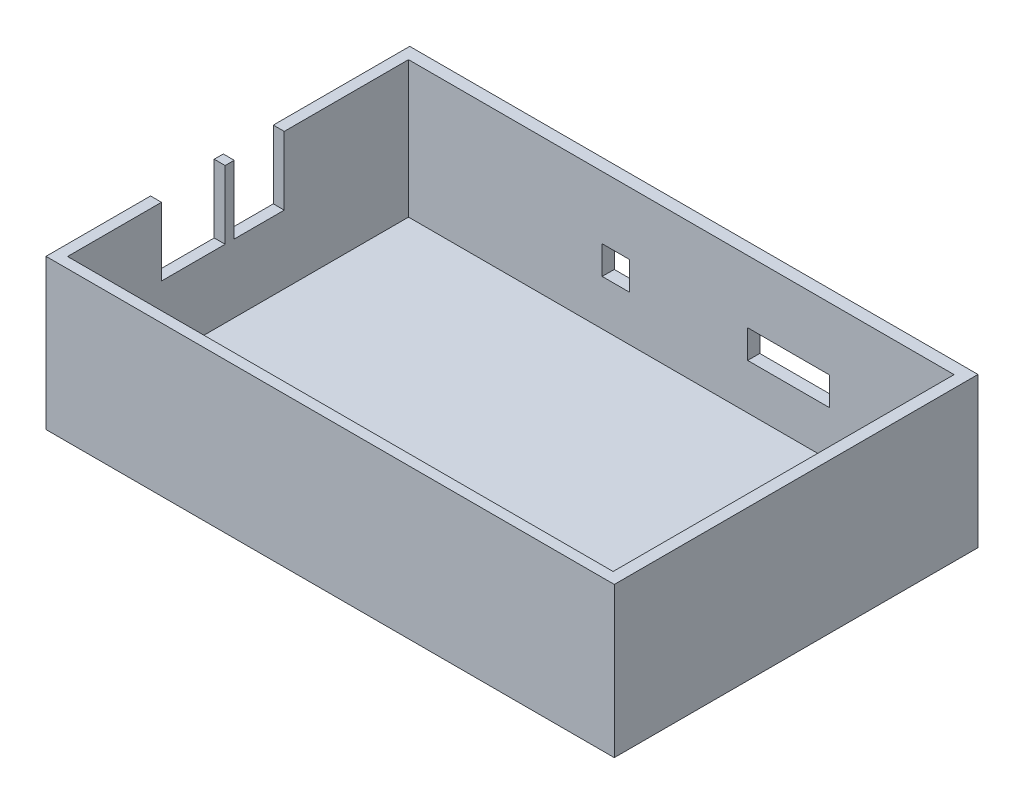
ISO-10303-21;
HEADER;
FILE_DESCRIPTION(('STEP AP214'),'2;1');
FILE_NAME('part.step','',(''),(''),'','','');
FILE_SCHEMA(('AUTOMOTIVE_DESIGN { 1 0 10303 214 1 1 1 1 }'));
ENDSEC;
DATA;
#1=APPLICATION_CONTEXT('core data for automotive mechanical design processes');
#2=APPLICATION_PROTOCOL_DEFINITION('international standard','automotive_design',2000,#1);
#3=PRODUCT_CONTEXT('',#1,'mechanical');
#4=PRODUCT('Part','Part','',(#3));
#5=PRODUCT_RELATED_PRODUCT_CATEGORY('part','',(#4));
#6=PRODUCT_DEFINITION_FORMATION('','',#4);
#7=PRODUCT_DEFINITION_CONTEXT('part definition',#1,'design');
#8=PRODUCT_DEFINITION('design','',#6,#7);
#9=PRODUCT_DEFINITION_SHAPE('','',#8);
#10=(LENGTH_UNIT() NAMED_UNIT(*) SI_UNIT(.MILLI.,.METRE.));
#11=(NAMED_UNIT(*) PLANE_ANGLE_UNIT() SI_UNIT($,.RADIAN.));
#12=(NAMED_UNIT(*) SI_UNIT($,.STERADIAN.) SOLID_ANGLE_UNIT());
#13=UNCERTAINTY_MEASURE_WITH_UNIT(LENGTH_MEASURE(1.E-05),#10,'distance_accuracy_value','');
#14=(GEOMETRIC_REPRESENTATION_CONTEXT(3) GLOBAL_UNCERTAINTY_ASSIGNED_CONTEXT((#13)) GLOBAL_UNIT_ASSIGNED_CONTEXT((#10,
#11,#12)) REPRESENTATION_CONTEXT('',''));
#15=CARTESIAN_POINT('',(0.,0.,0.));
#16=DIRECTION('',(0.,0.,1.));
#17=DIRECTION('',(1.,0.,0.));
#18=AXIS2_PLACEMENT_3D('',#15,#16,#17);
#19=CARTESIAN_POINT('',(0.,33.,0.));
#20=DIRECTION('',(0.,-1.,0.));
#21=DIRECTION('',(0.,0.,-1.));
#22=AXIS2_PLACEMENT_3D('',#19,#20,#21);
#23=PLANE('',#22);
#24=DIRECTION('',(0.,0.,1.));
#25=VECTOR('',#24,1.);
#26=CARTESIAN_POINT('',(0.,33.,0.));
#27=LINE('',#26,#25);
#28=CARTESIAN_POINT('',(0.,33.,-39.));
#29=VERTEX_POINT('',#28);
#30=CARTESIAN_POINT('',(0.,33.,-37.));
#31=VERTEX_POINT('',#30);
#32=EDGE_CURVE('E365',#29,#31,#27,.T.);
#33=ORIENTED_EDGE('',*,*,#32,.T.);
#34=DIRECTION('',(-1.,0.,0.));
#35=VECTOR('',#34,1.);
#36=CARTESIAN_POINT('',(-6.18134802853958,33.,-37.));
#37=LINE('',#36,#35);
#38=CARTESIAN_POINT('',(2.40382047502787,33.,-37.));
#39=VERTEX_POINT('',#38);
#40=EDGE_CURVE('E271',#39,#31,#37,.T.);
#41=ORIENTED_EDGE('',*,*,#40,.F.);
#42=DIRECTION('',(0.,0.,1.));
#43=VECTOR('',#42,1.);
#44=CARTESIAN_POINT('',(2.40382047502787,33.,-77.3360349520913));
#45=LINE('',#44,#43);
#46=CARTESIAN_POINT('',(2.40382047502787,33.,-39.));
#47=VERTEX_POINT('',#46);
#48=EDGE_CURVE('E337',#47,#39,#45,.T.);
#49=ORIENTED_EDGE('',*,*,#48,.F.);
#50=DIRECTION('',(1.,0.,0.));
#51=VECTOR('',#50,1.);
#52=CARTESIAN_POINT('',(-5.21205481039487,33.,-39.));
#53=LINE('',#52,#51);
#54=EDGE_CURVE('E236',#29,#47,#53,.T.);
#55=ORIENTED_EDGE('',*,*,#54,.F.);
#56=EDGE_LOOP('',(#33,#41,#49,#55));
#57=FACE_BOUND('',#56,.T.);
#58=ADVANCED_FACE('F36',(#57),#23,.F.);
#59=CARTESIAN_POINT('',(0.,33.,0.));
#60=DIRECTION('',(1.,0.,0.));
#61=DIRECTION('',(0.,0.,-1.));
#62=AXIS2_PLACEMENT_3D('',#59,#60,#61);
#63=PLANE('',#62);
#64=DIRECTION('',(0.,0.,1.));
#65=VECTOR('',#64,1.);
#66=CARTESIAN_POINT('',(0.,18.,0.));
#67=LINE('',#66,#65);
#68=CARTESIAN_POINT('',(0.,18.,-37.));
#69=VERTEX_POINT('',#68);
#70=CARTESIAN_POINT('',(0.,18.,-23.));
#71=VERTEX_POINT('',#70);
#72=EDGE_CURVE('E303',#69,#71,#67,.T.);
#73=ORIENTED_EDGE('',*,*,#72,.F.);
#74=DIRECTION('',(0.,1.,0.));
#75=VECTOR('',#74,1.);
#76=CARTESIAN_POINT('',(0.,33.,-37.));
#77=LINE('',#76,#75);
#78=EDGE_CURVE('E309',#69,#31,#77,.T.);
#79=ORIENTED_EDGE('',*,*,#78,.T.);
#80=ORIENTED_EDGE('',*,*,#32,.F.);
#81=DIRECTION('',(0.,-1.,0.));
#82=VECTOR('',#81,1.);
#83=CARTESIAN_POINT('',(0.,33.,-39.));
#84=LINE('',#83,#82);
#85=CARTESIAN_POINT('',(0.,18.,-39.));
#86=VERTEX_POINT('',#85);
#87=EDGE_CURVE('E295',#29,#86,#84,.T.);
#88=ORIENTED_EDGE('',*,*,#87,.T.);
#89=DIRECTION('',(0.,0.,1.));
#90=VECTOR('',#89,1.);
#91=CARTESIAN_POINT('',(0.,18.,0.));
#92=LINE('',#91,#90);
#93=CARTESIAN_POINT('',(0.,18.,-50.));
#94=VERTEX_POINT('',#93);
#95=EDGE_CURVE('E275',#94,#86,#92,.T.);
#96=ORIENTED_EDGE('',*,*,#95,.F.);
#97=DIRECTION('',(0.,1.,0.));
#98=VECTOR('',#97,1.);
#99=CARTESIAN_POINT('',(0.,33.,-50.));
#100=LINE('',#99,#98);
#101=CARTESIAN_POINT('',(0.,33.,-50.));
#102=VERTEX_POINT('',#101);
#103=EDGE_CURVE('E299',#94,#102,#100,.T.);
#104=ORIENTED_EDGE('',*,*,#103,.T.);
#105=CARTESIAN_POINT('',(0.,33.,-80.));
#106=VERTEX_POINT('',#105);
#107=EDGE_CURVE('E360',#106,#102,#27,.T.);
#108=ORIENTED_EDGE('',*,*,#107,.F.);
#109=DIRECTION('',(0.,-1.,0.));
#110=VECTOR('',#109,1.);
#111=CARTESIAN_POINT('',(0.,33.,-80.));
#112=LINE('',#111,#110);
#113=CARTESIAN_POINT('',(0.,0.,-80.));
#114=VERTEX_POINT('',#113);
#115=EDGE_CURVE('E375',#106,#114,#112,.T.);
#116=ORIENTED_EDGE('',*,*,#115,.T.);
#117=DIRECTION('',(0.,0.,1.));
#118=VECTOR('',#117,1.);
#119=CARTESIAN_POINT('',(0.,0.,0.));
#120=LINE('',#119,#118);
#121=CARTESIAN_POINT('',(0.,0.,0.));
#122=VERTEX_POINT('',#121);
#123=EDGE_CURVE('E350',#114,#122,#120,.T.);
#124=ORIENTED_EDGE('',*,*,#123,.T.);
#125=DIRECTION('',(0.,-1.,0.));
#126=VECTOR('',#125,1.);
#127=CARTESIAN_POINT('',(0.,33.,0.));
#128=LINE('',#127,#126);
#129=CARTESIAN_POINT('',(0.,33.,0.));
#130=VERTEX_POINT('',#129);
#131=EDGE_CURVE('E399',#130,#122,#128,.T.);
#132=ORIENTED_EDGE('',*,*,#131,.F.);
#133=CARTESIAN_POINT('',(0.,33.,-23.));
#134=VERTEX_POINT('',#133);
#135=EDGE_CURVE('E366',#134,#130,#27,.T.);
#136=ORIENTED_EDGE('',*,*,#135,.F.);
#137=DIRECTION('',(0.,-1.,0.));
#138=VECTOR('',#137,1.);
#139=CARTESIAN_POINT('',(0.,33.,-23.));
#140=LINE('',#139,#138);
#141=EDGE_CURVE('E306',#134,#71,#140,.T.);
#142=ORIENTED_EDGE('',*,*,#141,.T.);
#143=EDGE_LOOP('',(#73,#79,#80,#88,#96,#104,#108,#116,#124,#132,#136,#142));
#144=FACE_BOUND('',#143,.T.);
#145=ADVANCED_FACE('F38',(#144),#63,.F.);
#146=CARTESIAN_POINT('',(0.,33.,0.));
#147=DIRECTION('',(0.,0.,-1.));
#148=DIRECTION('',(-1.,0.,0.));
#149=AXIS2_PLACEMENT_3D('',#146,#147,#148);
#150=PLANE('',#149);
#151=DIRECTION('',(1.,0.,0.));
#152=VECTOR('',#151,1.);
#153=CARTESIAN_POINT('',(0.,0.,0.));
#154=LINE('',#153,#152);
#155=CARTESIAN_POINT('',(125.,0.,0.));
#156=VERTEX_POINT('',#155);
#157=EDGE_CURVE('E379',#122,#156,#154,.T.);
#158=ORIENTED_EDGE('',*,*,#157,.T.);
#159=DIRECTION('',(0.,-1.,0.));
#160=VECTOR('',#159,1.);
#161=CARTESIAN_POINT('',(125.,33.,0.));
#162=LINE('',#161,#160);
#163=CARTESIAN_POINT('',(125.,33.,0.));
#164=VERTEX_POINT('',#163);
#165=EDGE_CURVE('E395',#164,#156,#162,.T.);
#166=ORIENTED_EDGE('',*,*,#165,.F.);
#167=DIRECTION('',(1.,0.,0.));
#168=VECTOR('',#167,1.);
#169=CARTESIAN_POINT('',(0.,33.,0.));
#170=LINE('',#169,#168);
#171=EDGE_CURVE('E364',#130,#164,#170,.T.);
#172=ORIENTED_EDGE('',*,*,#171,.F.);
#173=ORIENTED_EDGE('',*,*,#131,.T.);
#174=EDGE_LOOP('',(#158,#166,#172,#173));
#175=FACE_BOUND('',#174,.T.);
#176=ADVANCED_FACE('F472',(#175),#150,.F.);
#177=CARTESIAN_POINT('',(125.,33.,0.));
#178=DIRECTION('',(-1.,0.,0.));
#179=DIRECTION('',(0.,0.,1.));
#180=AXIS2_PLACEMENT_3D('',#177,#178,#179);
#181=PLANE('',#180);
#182=DIRECTION('',(0.,0.,-1.));
#183=VECTOR('',#182,1.);
#184=CARTESIAN_POINT('',(125.,0.,0.));
#185=LINE('',#184,#183);
#186=CARTESIAN_POINT('',(125.,0.,-80.));
#187=VERTEX_POINT('',#186);
#188=EDGE_CURVE('E382',#156,#187,#185,.T.);
#189=ORIENTED_EDGE('',*,*,#188,.T.);
#190=DIRECTION('',(0.,-1.,0.));
#191=VECTOR('',#190,1.);
#192=CARTESIAN_POINT('',(125.,33.,-80.));
#193=LINE('',#192,#191);
#194=CARTESIAN_POINT('',(125.,33.,-80.));
#195=VERTEX_POINT('',#194);
#196=EDGE_CURVE('E391',#195,#187,#193,.T.);
#197=ORIENTED_EDGE('',*,*,#196,.F.);
#198=DIRECTION('',(0.,0.,-1.));
#199=VECTOR('',#198,1.);
#200=CARTESIAN_POINT('',(125.,33.,0.));
#201=LINE('',#200,#199);
#202=EDGE_CURVE('E369',#164,#195,#201,.T.);
#203=ORIENTED_EDGE('',*,*,#202,.F.);
#204=ORIENTED_EDGE('',*,*,#165,.T.);
#205=EDGE_LOOP('',(#189,#197,#203,#204));
#206=FACE_BOUND('',#205,.T.);
#207=ADVANCED_FACE('F485',(#206),#181,.F.);
#208=CARTESIAN_POINT('',(0.,33.,-80.));
#209=DIRECTION('',(0.,0.,1.));
#210=DIRECTION('',(1.,0.,0.));
#211=AXIS2_PLACEMENT_3D('',#208,#209,#210);
#212=PLANE('',#211);
#213=DIRECTION('',(1.,0.,0.));
#214=VECTOR('',#213,1.);
#215=CARTESIAN_POINT('',(45.,19.2311706880732,-80.));
#216=LINE('',#215,#214);
#217=CARTESIAN_POINT('',(45.,19.2311706880732,-80.));
#218=VERTEX_POINT('',#217);
#219=CARTESIAN_POINT('',(51.,19.2311706880732,-80.));
#220=VERTEX_POINT('',#219);
#221=EDGE_CURVE('E216',#218,#220,#216,.T.);
#222=ORIENTED_EDGE('',*,*,#221,.F.);
#223=DIRECTION('',(0.,1.,0.));
#224=VECTOR('',#223,1.);
#225=CARTESIAN_POINT('',(45.,13.,-80.));
#226=LINE('',#225,#224);
#227=CARTESIAN_POINT('',(45.,13.,-80.));
#228=VERTEX_POINT('',#227);
#229=EDGE_CURVE('E52',#228,#218,#226,.T.);
#230=ORIENTED_EDGE('',*,*,#229,.F.);
#231=DIRECTION('',(-1.,0.,0.));
#232=VECTOR('',#231,1.);
#233=CARTESIAN_POINT('',(45.,13.,-80.));
#234=LINE('',#233,#232);
#235=CARTESIAN_POINT('',(51.,13.,-80.));
#236=VERTEX_POINT('',#235);
#237=EDGE_CURVE('E224',#236,#228,#234,.T.);
#238=ORIENTED_EDGE('',*,*,#237,.F.);
#239=DIRECTION('',(0.,-1.,0.));
#240=VECTOR('',#239,1.);
#241=CARTESIAN_POINT('',(51.,13.,-80.));
#242=LINE('',#241,#240);
#243=EDGE_CURVE('E205',#220,#236,#242,.T.);
#244=ORIENTED_EDGE('',*,*,#243,.F.);
#245=EDGE_LOOP('',(#222,#230,#238,#244));
#246=FACE_BOUND('',#245,.T.);
#247=DIRECTION('',(1.,0.,0.));
#248=VECTOR('',#247,1.);
#249=CARTESIAN_POINT('',(77.,19.2311706880731,-80.));
#250=LINE('',#249,#248);
#251=CARTESIAN_POINT('',(77.,19.2311706880731,-80.));
#252=VERTEX_POINT('',#251);
#253=CARTESIAN_POINT('',(95.,19.2311706880731,-80.));
#254=VERTEX_POINT('',#253);
#255=EDGE_CURVE('E243',#252,#254,#250,.T.);
#256=ORIENTED_EDGE('',*,*,#255,.F.);
#257=DIRECTION('',(0.,1.,0.));
#258=VECTOR('',#257,1.);
#259=CARTESIAN_POINT('',(77.,13.,-80.));
#260=LINE('',#259,#258);
#261=CARTESIAN_POINT('',(77.,13.,-80.));
#262=VERTEX_POINT('',#261);
#263=EDGE_CURVE('E60',#262,#252,#260,.T.);
#264=ORIENTED_EDGE('',*,*,#263,.F.);
#265=DIRECTION('',(-1.,0.,0.));
#266=VECTOR('',#265,1.);
#267=CARTESIAN_POINT('',(77.,13.,-80.));
#268=LINE('',#267,#266);
#269=CARTESIAN_POINT('',(95.,13.,-80.));
#270=VERTEX_POINT('',#269);
#271=EDGE_CURVE('E251',#270,#262,#268,.T.);
#272=ORIENTED_EDGE('',*,*,#271,.F.);
#273=DIRECTION('',(0.,-1.,0.));
#274=VECTOR('',#273,1.);
#275=CARTESIAN_POINT('',(95.,13.,-80.));
#276=LINE('',#275,#274);
#277=EDGE_CURVE('E247',#254,#270,#276,.T.);
#278=ORIENTED_EDGE('',*,*,#277,.F.);
#279=EDGE_LOOP('',(#256,#264,#272,#278));
#280=FACE_BOUND('',#279,.T.);
#281=DIRECTION('',(-1.,0.,0.));
#282=VECTOR('',#281,1.);
#283=CARTESIAN_POINT('',(0.,0.,-80.));
#284=LINE('',#283,#282);
#285=EDGE_CURVE('E385',#187,#114,#284,.T.);
#286=ORIENTED_EDGE('',*,*,#285,.T.);
#287=ORIENTED_EDGE('',*,*,#115,.F.);
#288=DIRECTION('',(-1.,0.,0.));
#289=VECTOR('',#288,1.);
#290=CARTESIAN_POINT('',(0.,33.,-80.));
#291=LINE('',#290,#289);
#292=EDGE_CURVE('E372',#195,#106,#291,.T.);
#293=ORIENTED_EDGE('',*,*,#292,.F.);
#294=ORIENTED_EDGE('',*,*,#196,.T.);
#295=EDGE_LOOP('',(#286,#287,#293,#294));
#296=FACE_BOUND('',#295,.T.);
#297=ADVANCED_FACE('F221',(#246,#280,#296),#212,.F.);
#298=CARTESIAN_POINT('',(2.40382047502787,33.,-23.));
#299=VERTEX_POINT('',#298);
#300=CARTESIAN_POINT('',(2.40382047502787,33.,-2.33603495209132));
#301=VERTEX_POINT('',#300);
#302=EDGE_CURVE('E313',#299,#301,#45,.T.);
#303=ORIENTED_EDGE('',*,*,#302,.F.);
#304=DIRECTION('',(1.,0.,0.));
#305=VECTOR('',#304,1.);
#306=CARTESIAN_POINT('',(-6.18134802853958,33.,-23.));
#307=LINE('',#306,#305);
#308=EDGE_CURVE('E276',#134,#299,#307,.T.);
#309=ORIENTED_EDGE('',*,*,#308,.F.);
#310=ORIENTED_EDGE('',*,*,#135,.T.);
#311=ORIENTED_EDGE('',*,*,#171,.T.);
#312=ORIENTED_EDGE('',*,*,#202,.T.);
#313=ORIENTED_EDGE('',*,*,#292,.T.);
#314=ORIENTED_EDGE('',*,*,#107,.T.);
#315=DIRECTION('',(-1.,0.,0.));
#316=VECTOR('',#315,1.);
#317=CARTESIAN_POINT('',(-5.21205481039487,33.,-50.));
#318=LINE('',#317,#316);
#319=CARTESIAN_POINT('',(2.40382047502786,33.,-50.));
#320=VERTEX_POINT('',#319);
#321=EDGE_CURVE('E285',#320,#102,#318,.T.);
#322=ORIENTED_EDGE('',*,*,#321,.F.);
#323=CARTESIAN_POINT('',(2.40382047502787,33.,-77.3360349520913));
#324=VERTEX_POINT('',#323);
#325=EDGE_CURVE('E332',#324,#320,#45,.T.);
#326=ORIENTED_EDGE('',*,*,#325,.F.);
#327=DIRECTION('',(-1.,0.,0.));
#328=VECTOR('',#327,1.);
#329=CARTESIAN_POINT('',(2.40382047502787,33.,-77.3360349520913));
#330=LINE('',#329,#328);
#331=CARTESIAN_POINT('',(122.403820475028,33.,-77.3360349520913));
#332=VERTEX_POINT('',#331);
#333=EDGE_CURVE('E319',#332,#324,#330,.T.);
#334=ORIENTED_EDGE('',*,*,#333,.F.);
#335=DIRECTION('',(0.,0.,-1.));
#336=VECTOR('',#335,1.);
#337=CARTESIAN_POINT('',(122.403820475028,33.,-77.3360349520913));
#338=LINE('',#337,#336);
#339=CARTESIAN_POINT('',(122.403820475028,33.,-2.33603495209132));
#340=VERTEX_POINT('',#339);
#341=EDGE_CURVE('E341',#340,#332,#338,.T.);
#342=ORIENTED_EDGE('',*,*,#341,.F.);
#343=DIRECTION('',(1.,0.,0.));
#344=VECTOR('',#343,1.);
#345=CARTESIAN_POINT('',(2.40382047502787,33.,-2.33603495209132));
#346=LINE('',#345,#344);
#347=EDGE_CURVE('E336',#301,#340,#346,.T.);
#348=ORIENTED_EDGE('',*,*,#347,.F.);
#349=EDGE_LOOP('',(#303,#309,#310,#311,#312,#313,#314,#322,#326,#334,#342,#348));
#350=FACE_BOUND('',#349,.T.);
#351=ADVANCED_FACE('F469',(#350),#23,.F.);
#352=CARTESIAN_POINT('',(0.,0.,0.));
#353=DIRECTION('',(0.,-1.,0.));
#354=DIRECTION('',(0.,0.,-1.));
#355=AXIS2_PLACEMENT_3D('',#352,#353,#354);
#356=PLANE('',#355);
#357=ORIENTED_EDGE('',*,*,#123,.F.);
#358=ORIENTED_EDGE('',*,*,#285,.F.);
#359=ORIENTED_EDGE('',*,*,#188,.F.);
#360=ORIENTED_EDGE('',*,*,#157,.F.);
#361=EDGE_LOOP('',(#357,#358,#359,#360));
#362=FACE_BOUND('',#361,.T.);
#363=ADVANCED_FACE('F478',(#362),#356,.T.);
#364=CARTESIAN_POINT('',(2.40382047502787,3.,-77.3360349520913));
#365=DIRECTION('',(-1.,0.,0.));
#366=DIRECTION('',(0.,0.,1.));
#367=AXIS2_PLACEMENT_3D('',#364,#365,#366);
#368=PLANE('',#367);
#369=ORIENTED_EDGE('',*,*,#48,.T.);
#370=DIRECTION('',(0.,-1.,0.));
#371=VECTOR('',#370,1.);
#372=CARTESIAN_POINT('',(2.40382047502787,3.,-37.));
#373=LINE('',#372,#371);
#374=CARTESIAN_POINT('',(2.40382047502787,18.,-37.));
#375=VERTEX_POINT('',#374);
#376=EDGE_CURVE('E421',#39,#375,#373,.T.);
#377=ORIENTED_EDGE('',*,*,#376,.T.);
#378=DIRECTION('',(0.,0.,-1.));
#379=VECTOR('',#378,1.);
#380=CARTESIAN_POINT('',(2.40382047502787,18.,-77.3360349520913));
#381=LINE('',#380,#379);
#382=CARTESIAN_POINT('',(2.40382047502787,18.,-23.));
#383=VERTEX_POINT('',#382);
#384=EDGE_CURVE('E414',#383,#375,#381,.T.);
#385=ORIENTED_EDGE('',*,*,#384,.F.);
#386=DIRECTION('',(0.,1.,0.));
#387=VECTOR('',#386,1.);
#388=CARTESIAN_POINT('',(2.40382047502787,3.,-23.));
#389=LINE('',#388,#387);
#390=EDGE_CURVE('E417',#383,#299,#389,.T.);
#391=ORIENTED_EDGE('',*,*,#390,.T.);
#392=ORIENTED_EDGE('',*,*,#302,.T.);
#393=DIRECTION('',(0.,1.,0.));
#394=VECTOR('',#393,1.);
#395=CARTESIAN_POINT('',(2.40382047502787,3.,-2.33603495209132));
#396=LINE('',#395,#394);
#397=CARTESIAN_POINT('',(2.40382047502787,3.,-2.33603495209132));
#398=VERTEX_POINT('',#397);
#399=EDGE_CURVE('E331',#398,#301,#396,.T.);
#400=ORIENTED_EDGE('',*,*,#399,.F.);
#401=DIRECTION('',(0.,0.,1.));
#402=VECTOR('',#401,1.);
#403=CARTESIAN_POINT('',(2.40382047502787,3.,-77.3360349520913));
#404=LINE('',#403,#402);
#405=CARTESIAN_POINT('',(2.40382047502787,3.,-77.3360349520913));
#406=VERTEX_POINT('',#405);
#407=EDGE_CURVE('E314',#406,#398,#404,.T.);
#408=ORIENTED_EDGE('',*,*,#407,.F.);
#409=DIRECTION('',(0.,1.,0.));
#410=VECTOR('',#409,1.);
#411=CARTESIAN_POINT('',(2.40382047502787,3.,-77.3360349520913));
#412=LINE('',#411,#410);
#413=EDGE_CURVE('E347',#406,#324,#412,.T.);
#414=ORIENTED_EDGE('',*,*,#413,.T.);
#415=ORIENTED_EDGE('',*,*,#325,.T.);
#416=DIRECTION('',(0.,-1.,0.));
#417=VECTOR('',#416,1.);
#418=CARTESIAN_POINT('',(2.40382047502787,3.,-50.));
#419=LINE('',#418,#417);
#420=CARTESIAN_POINT('',(2.40382047502786,18.,-50.));
#421=VERTEX_POINT('',#420);
#422=EDGE_CURVE('E410',#320,#421,#419,.T.);
#423=ORIENTED_EDGE('',*,*,#422,.T.);
#424=DIRECTION('',(0.,0.,-1.));
#425=VECTOR('',#424,1.);
#426=CARTESIAN_POINT('',(2.40382047502787,18.,-77.3360349520913));
#427=LINE('',#426,#425);
#428=CARTESIAN_POINT('',(2.40382047502787,18.,-39.));
#429=VERTEX_POINT('',#428);
#430=EDGE_CURVE('E403',#429,#421,#427,.T.);
#431=ORIENTED_EDGE('',*,*,#430,.F.);
#432=DIRECTION('',(0.,1.,0.));
#433=VECTOR('',#432,1.);
#434=CARTESIAN_POINT('',(2.40382047502787,3.,-39.));
#435=LINE('',#434,#433);
#436=EDGE_CURVE('E406',#429,#47,#435,.T.);
#437=ORIENTED_EDGE('',*,*,#436,.T.);
#438=EDGE_LOOP('',(#369,#377,#385,#391,#392,#400,#408,#414,#415,#423,#431,#437));
#439=FACE_BOUND('',#438,.T.);
#440=ADVANCED_FACE('F483',(#439),#368,.F.);
#441=CARTESIAN_POINT('',(2.40382047502787,3.,-77.3360349520913));
#442=DIRECTION('',(0.,0.,-1.));
#443=DIRECTION('',(-1.,0.,0.));
#444=AXIS2_PLACEMENT_3D('',#441,#442,#443);
#445=PLANE('',#444);
#446=DIRECTION('',(-1.,0.,0.));
#447=VECTOR('',#446,1.);
#448=CARTESIAN_POINT('',(2.40382047502787,13.,-77.3360349520913));
#449=LINE('',#448,#447);
#450=CARTESIAN_POINT('',(51.,13.,-77.3360349520913));
#451=VERTEX_POINT('',#450);
#452=CARTESIAN_POINT('',(45.,13.,-77.3360349520913));
#453=VERTEX_POINT('',#452);
#454=EDGE_CURVE('E45',#451,#453,#449,.T.);
#455=ORIENTED_EDGE('',*,*,#454,.T.);
#456=DIRECTION('',(0.,1.,0.));
#457=VECTOR('',#456,1.);
#458=CARTESIAN_POINT('',(45.,3.,-77.3360349520913));
#459=LINE('',#458,#457);
#460=CARTESIAN_POINT('',(45.,19.2311706880732,-77.3360349520913));
#461=VERTEX_POINT('',#460);
#462=EDGE_CURVE('E11',#453,#461,#459,.T.);
#463=ORIENTED_EDGE('',*,*,#462,.T.);
#464=DIRECTION('',(1.,0.,0.));
#465=VECTOR('',#464,1.);
#466=CARTESIAN_POINT('',(2.40382047502787,19.2311706880732,-77.3360349520913));
#467=LINE('',#466,#465);
#468=CARTESIAN_POINT('',(51.,19.2311706880732,-77.3360349520913));
#469=VERTEX_POINT('',#468);
#470=EDGE_CURVE('E441',#461,#469,#467,.T.);
#471=ORIENTED_EDGE('',*,*,#470,.T.);
#472=DIRECTION('',(0.,-1.,0.));
#473=VECTOR('',#472,1.);
#474=CARTESIAN_POINT('',(51.,3.,-77.3360349520913));
#475=LINE('',#474,#473);
#476=EDGE_CURVE('E208',#469,#451,#475,.T.);
#477=ORIENTED_EDGE('',*,*,#476,.T.);
#478=EDGE_LOOP('',(#455,#463,#471,#477));
#479=FACE_BOUND('',#478,.T.);
#480=DIRECTION('',(-1.,0.,0.));
#481=VECTOR('',#480,1.);
#482=CARTESIAN_POINT('',(2.40382047502787,13.,-77.3360349520913));
#483=LINE('',#482,#481);
#484=CARTESIAN_POINT('',(95.,13.,-77.3360349520913));
#485=VERTEX_POINT('',#484);
#486=CARTESIAN_POINT('',(77.,13.,-77.3360349520913));
#487=VERTEX_POINT('',#486);
#488=EDGE_CURVE('E433',#485,#487,#483,.T.);
#489=ORIENTED_EDGE('',*,*,#488,.T.);
#490=DIRECTION('',(0.,1.,0.));
#491=VECTOR('',#490,1.);
#492=CARTESIAN_POINT('',(77.,3.,-77.3360349520913));
#493=LINE('',#492,#491);
#494=CARTESIAN_POINT('',(77.,19.2311706880731,-77.3360349520913));
#495=VERTEX_POINT('',#494);
#496=EDGE_CURVE('E437',#487,#495,#493,.T.);
#497=ORIENTED_EDGE('',*,*,#496,.T.);
#498=DIRECTION('',(1.,0.,0.));
#499=VECTOR('',#498,1.);
#500=CARTESIAN_POINT('',(2.40382047502787,19.2311706880731,-77.3360349520913));
#501=LINE('',#500,#499);
#502=CARTESIAN_POINT('',(95.,19.2311706880731,-77.3360349520913));
#503=VERTEX_POINT('',#502);
#504=EDGE_CURVE('E425',#495,#503,#501,.T.);
#505=ORIENTED_EDGE('',*,*,#504,.T.);
#506=DIRECTION('',(0.,-1.,0.));
#507=VECTOR('',#506,1.);
#508=CARTESIAN_POINT('',(95.,3.,-77.3360349520913));
#509=LINE('',#508,#507);
#510=EDGE_CURVE('E429',#503,#485,#509,.T.);
#511=ORIENTED_EDGE('',*,*,#510,.T.);
#512=EDGE_LOOP('',(#489,#497,#505,#511));
#513=FACE_BOUND('',#512,.T.);
#514=ORIENTED_EDGE('',*,*,#333,.T.);
#515=ORIENTED_EDGE('',*,*,#413,.F.);
#516=DIRECTION('',(-1.,0.,0.));
#517=VECTOR('',#516,1.);
#518=CARTESIAN_POINT('',(2.40382047502787,3.,-77.3360349520913));
#519=LINE('',#518,#517);
#520=CARTESIAN_POINT('',(122.403820475028,3.,-77.3360349520913));
#521=VERTEX_POINT('',#520);
#522=EDGE_CURVE('E327',#521,#406,#519,.T.);
#523=ORIENTED_EDGE('',*,*,#522,.F.);
#524=DIRECTION('',(0.,1.,0.));
#525=VECTOR('',#524,1.);
#526=CARTESIAN_POINT('',(122.403820475028,3.,-77.3360349520913));
#527=LINE('',#526,#525);
#528=EDGE_CURVE('E351',#521,#332,#527,.T.);
#529=ORIENTED_EDGE('',*,*,#528,.T.);
#530=EDGE_LOOP('',(#514,#515,#523,#529));
#531=FACE_BOUND('',#530,.T.);
#532=ADVANCED_FACE('F448',(#479,#513,#531),#445,.F.);
#533=CARTESIAN_POINT('',(122.403820475028,3.,-77.3360349520913));
#534=DIRECTION('',(1.,0.,0.));
#535=DIRECTION('',(0.,0.,-1.));
#536=AXIS2_PLACEMENT_3D('',#533,#534,#535);
#537=PLANE('',#536);
#538=ORIENTED_EDGE('',*,*,#341,.T.);
#539=ORIENTED_EDGE('',*,*,#528,.F.);
#540=DIRECTION('',(0.,0.,-1.));
#541=VECTOR('',#540,1.);
#542=CARTESIAN_POINT('',(122.403820475028,3.,-77.3360349520913));
#543=LINE('',#542,#541);
#544=CARTESIAN_POINT('',(122.403820475028,3.,-2.33603495209132));
#545=VERTEX_POINT('',#544);
#546=EDGE_CURVE('E323',#545,#521,#543,.T.);
#547=ORIENTED_EDGE('',*,*,#546,.F.);
#548=DIRECTION('',(0.,1.,0.));
#549=VECTOR('',#548,1.);
#550=CARTESIAN_POINT('',(122.403820475028,3.,-2.33603495209132));
#551=LINE('',#550,#549);
#552=EDGE_CURVE('E354',#545,#340,#551,.T.);
#553=ORIENTED_EDGE('',*,*,#552,.T.);
#554=EDGE_LOOP('',(#538,#539,#547,#553));
#555=FACE_BOUND('',#554,.T.);
#556=ADVANCED_FACE('F542',(#555),#537,.F.);
#557=CARTESIAN_POINT('',(2.40382047502787,3.,-2.33603495209132));
#558=DIRECTION('',(0.,0.,1.));
#559=DIRECTION('',(1.,0.,0.));
#560=AXIS2_PLACEMENT_3D('',#557,#558,#559);
#561=PLANE('',#560);
#562=ORIENTED_EDGE('',*,*,#347,.T.);
#563=ORIENTED_EDGE('',*,*,#552,.F.);
#564=DIRECTION('',(1.,0.,0.));
#565=VECTOR('',#564,1.);
#566=CARTESIAN_POINT('',(2.40382047502787,3.,-2.33603495209132));
#567=LINE('',#566,#565);
#568=EDGE_CURVE('E318',#398,#545,#567,.T.);
#569=ORIENTED_EDGE('',*,*,#568,.F.);
#570=ORIENTED_EDGE('',*,*,#399,.T.);
#571=EDGE_LOOP('',(#562,#563,#569,#570));
#572=FACE_BOUND('',#571,.T.);
#573=ADVANCED_FACE('F538',(#572),#561,.F.);
#574=CARTESIAN_POINT('',(0.,3.,0.));
#575=DIRECTION('',(0.,1.,0.));
#576=DIRECTION('',(0.,0.,1.));
#577=AXIS2_PLACEMENT_3D('',#574,#575,#576);
#578=PLANE('',#577);
#579=ORIENTED_EDGE('',*,*,#407,.T.);
#580=ORIENTED_EDGE('',*,*,#568,.T.);
#581=ORIENTED_EDGE('',*,*,#546,.T.);
#582=ORIENTED_EDGE('',*,*,#522,.T.);
#583=EDGE_LOOP('',(#579,#580,#581,#582));
#584=FACE_BOUND('',#583,.T.);
#585=ADVANCED_FACE('F531',(#584),#578,.T.);
#586=CARTESIAN_POINT('',(-5.21205481039487,18.,-50.));
#587=DIRECTION('',(0.,0.,-1.));
#588=DIRECTION('',(-1.,0.,0.));
#589=AXIS2_PLACEMENT_3D('',#586,#587,#588);
#590=PLANE('',#589);
#591=DIRECTION('',(-1.,0.,0.));
#592=VECTOR('',#591,1.);
#593=CARTESIAN_POINT('',(-5.21205481039487,18.,-50.));
#594=LINE('',#593,#592);
#595=EDGE_CURVE('E279',#421,#94,#594,.T.);
#596=ORIENTED_EDGE('',*,*,#595,.F.);
#597=ORIENTED_EDGE('',*,*,#422,.F.);
#598=ORIENTED_EDGE('',*,*,#321,.T.);
#599=ORIENTED_EDGE('',*,*,#103,.F.);
#600=EDGE_LOOP('',(#596,#597,#598,#599));
#601=FACE_BOUND('',#600,.T.);
#602=ADVANCED_FACE('F528',(#601),#590,.F.);
#603=CARTESIAN_POINT('',(-5.21205481039487,18.,-39.));
#604=DIRECTION('',(0.,0.,1.));
#605=DIRECTION('',(1.,0.,0.));
#606=AXIS2_PLACEMENT_3D('',#603,#604,#605);
#607=PLANE('',#606);
#608=ORIENTED_EDGE('',*,*,#54,.T.);
#609=ORIENTED_EDGE('',*,*,#436,.F.);
#610=DIRECTION('',(1.,0.,0.));
#611=VECTOR('',#610,1.);
#612=CARTESIAN_POINT('',(-5.21205481039487,18.,-39.));
#613=LINE('',#612,#611);
#614=EDGE_CURVE('E282',#86,#429,#613,.T.);
#615=ORIENTED_EDGE('',*,*,#614,.F.);
#616=ORIENTED_EDGE('',*,*,#87,.F.);
#617=EDGE_LOOP('',(#608,#609,#615,#616));
#618=FACE_BOUND('',#617,.T.);
#619=ADVANCED_FACE('F526',(#618),#607,.F.);
#620=CARTESIAN_POINT('',(0.,18.,0.));
#621=DIRECTION('',(0.,1.,0.));
#622=DIRECTION('',(0.,0.,1.));
#623=AXIS2_PLACEMENT_3D('',#620,#621,#622);
#624=PLANE('',#623);
#625=ORIENTED_EDGE('',*,*,#95,.T.);
#626=ORIENTED_EDGE('',*,*,#614,.T.);
#627=ORIENTED_EDGE('',*,*,#430,.T.);
#628=ORIENTED_EDGE('',*,*,#595,.T.);
#629=EDGE_LOOP('',(#625,#626,#627,#628));
#630=FACE_BOUND('',#629,.T.);
#631=ADVANCED_FACE('F521',(#630),#624,.T.);
#632=CARTESIAN_POINT('',(-6.18134802853958,18.,-37.));
#633=DIRECTION('',(0.,0.,-1.));
#634=DIRECTION('',(-1.,0.,0.));
#635=AXIS2_PLACEMENT_3D('',#632,#633,#634);
#636=PLANE('',#635);
#637=DIRECTION('',(-1.,0.,0.));
#638=VECTOR('',#637,1.);
#639=CARTESIAN_POINT('',(-6.18134802853958,18.,-37.));
#640=LINE('',#639,#638);
#641=EDGE_CURVE('E270',#375,#69,#640,.T.);
#642=ORIENTED_EDGE('',*,*,#641,.F.);
#643=ORIENTED_EDGE('',*,*,#376,.F.);
#644=ORIENTED_EDGE('',*,*,#40,.T.);
#645=ORIENTED_EDGE('',*,*,#78,.F.);
#646=EDGE_LOOP('',(#642,#643,#644,#645));
#647=FACE_BOUND('',#646,.T.);
#648=ADVANCED_FACE('F506',(#647),#636,.F.);
#649=CARTESIAN_POINT('',(-6.18134802853958,18.,-23.));
#650=DIRECTION('',(0.,0.,1.));
#651=DIRECTION('',(1.,0.,0.));
#652=AXIS2_PLACEMENT_3D('',#649,#650,#651);
#653=PLANE('',#652);
#654=ORIENTED_EDGE('',*,*,#308,.T.);
#655=ORIENTED_EDGE('',*,*,#390,.F.);
#656=DIRECTION('',(1.,0.,0.));
#657=VECTOR('',#656,1.);
#658=CARTESIAN_POINT('',(-6.18134802853958,18.,-23.));
#659=LINE('',#658,#657);
#660=EDGE_CURVE('E267',#71,#383,#659,.T.);
#661=ORIENTED_EDGE('',*,*,#660,.F.);
#662=ORIENTED_EDGE('',*,*,#141,.F.);
#663=EDGE_LOOP('',(#654,#655,#661,#662));
#664=FACE_BOUND('',#663,.T.);
#665=ADVANCED_FACE('F513',(#664),#653,.F.);
#666=CARTESIAN_POINT('',(0.,18.,0.));
#667=DIRECTION('',(0.,1.,0.));
#668=DIRECTION('',(0.,0.,1.));
#669=AXIS2_PLACEMENT_3D('',#666,#667,#668);
#670=PLANE('',#669);
#671=ORIENTED_EDGE('',*,*,#72,.T.);
#672=ORIENTED_EDGE('',*,*,#660,.T.);
#673=ORIENTED_EDGE('',*,*,#384,.T.);
#674=ORIENTED_EDGE('',*,*,#641,.T.);
#675=EDGE_LOOP('',(#671,#672,#673,#674));
#676=FACE_BOUND('',#675,.T.);
#677=ADVANCED_FACE('F510',(#676),#670,.T.);
#678=CARTESIAN_POINT('',(77.,13.,-65.));
#679=DIRECTION('',(-1.,0.,0.));
#680=DIRECTION('',(0.,0.,1.));
#681=AXIS2_PLACEMENT_3D('',#678,#679,#680);
#682=PLANE('',#681);
#683=DIRECTION('',(0.,0.,-1.));
#684=VECTOR('',#683,1.);
#685=CARTESIAN_POINT('',(77.,13.,-65.));
#686=LINE('',#685,#684);
#687=EDGE_CURVE('E256',#487,#262,#686,.T.);
#688=ORIENTED_EDGE('',*,*,#687,.T.);
#689=ORIENTED_EDGE('',*,*,#263,.T.);
#690=DIRECTION('',(0.,0.,-1.));
#691=VECTOR('',#690,1.);
#692=CARTESIAN_POINT('',(77.,19.2311706880731,-65.));
#693=LINE('',#692,#691);
#694=EDGE_CURVE('E255',#495,#252,#693,.T.);
#695=ORIENTED_EDGE('',*,*,#694,.F.);
#696=ORIENTED_EDGE('',*,*,#496,.F.);
#697=EDGE_LOOP('',(#688,#689,#695,#696));
#698=FACE_BOUND('',#697,.T.);
#699=ADVANCED_FACE('F519',(#698),#682,.F.);
#700=CARTESIAN_POINT('',(77.,13.,-65.));
#701=DIRECTION('',(0.,-1.,0.));
#702=DIRECTION('',(1.,0.,0.));
#703=AXIS2_PLACEMENT_3D('',#700,#701,#702);
#704=PLANE('',#703);
#705=DIRECTION('',(0.,0.,-1.));
#706=VECTOR('',#705,1.);
#707=CARTESIAN_POINT('',(95.,13.,-65.));
#708=LINE('',#707,#706);
#709=EDGE_CURVE('E259',#485,#270,#708,.T.);
#710=ORIENTED_EDGE('',*,*,#709,.T.);
#711=ORIENTED_EDGE('',*,*,#271,.T.);
#712=ORIENTED_EDGE('',*,*,#687,.F.);
#713=ORIENTED_EDGE('',*,*,#488,.F.);
#714=EDGE_LOOP('',(#710,#711,#712,#713));
#715=FACE_BOUND('',#714,.T.);
#716=ADVANCED_FACE('F594',(#715),#704,.F.);
#717=CARTESIAN_POINT('',(95.,13.,-65.));
#718=DIRECTION('',(1.,0.,0.));
#719=DIRECTION('',(0.,0.,-1.));
#720=AXIS2_PLACEMENT_3D('',#717,#718,#719);
#721=PLANE('',#720);
#722=DIRECTION('',(0.,0.,-1.));
#723=VECTOR('',#722,1.);
#724=CARTESIAN_POINT('',(95.,19.2311706880731,-65.));
#725=LINE('',#724,#723);
#726=EDGE_CURVE('E262',#503,#254,#725,.T.);
#727=ORIENTED_EDGE('',*,*,#726,.T.);
#728=ORIENTED_EDGE('',*,*,#277,.T.);
#729=ORIENTED_EDGE('',*,*,#709,.F.);
#730=ORIENTED_EDGE('',*,*,#510,.F.);
#731=EDGE_LOOP('',(#727,#728,#729,#730));
#732=FACE_BOUND('',#731,.T.);
#733=ADVANCED_FACE('F461',(#732),#721,.F.);
#734=CARTESIAN_POINT('',(77.,19.2311706880731,-65.));
#735=DIRECTION('',(0.,1.,0.));
#736=DIRECTION('',(0.,0.,1.));
#737=AXIS2_PLACEMENT_3D('',#734,#735,#736);
#738=PLANE('',#737);
#739=ORIENTED_EDGE('',*,*,#694,.T.);
#740=ORIENTED_EDGE('',*,*,#255,.T.);
#741=ORIENTED_EDGE('',*,*,#726,.F.);
#742=ORIENTED_EDGE('',*,*,#504,.F.);
#743=EDGE_LOOP('',(#739,#740,#741,#742));
#744=FACE_BOUND('',#743,.T.);
#745=ADVANCED_FACE('F455',(#744),#738,.F.);
#746=CARTESIAN_POINT('',(45.,13.,-65.));
#747=DIRECTION('',(-1.,0.,0.));
#748=DIRECTION('',(0.,0.,1.));
#749=AXIS2_PLACEMENT_3D('',#746,#747,#748);
#750=PLANE('',#749);
#751=DIRECTION('',(0.,0.,-1.));
#752=VECTOR('',#751,1.);
#753=CARTESIAN_POINT('',(45.,13.,-65.));
#754=LINE('',#753,#752);
#755=EDGE_CURVE('E233',#453,#228,#754,.T.);
#756=ORIENTED_EDGE('',*,*,#755,.T.);
#757=ORIENTED_EDGE('',*,*,#229,.T.);
#758=DIRECTION('',(0.,0.,-1.));
#759=VECTOR('',#758,1.);
#760=CARTESIAN_POINT('',(45.,19.2311706880732,-65.));
#761=LINE('',#760,#759);
#762=EDGE_CURVE('E213',#461,#218,#761,.T.);
#763=ORIENTED_EDGE('',*,*,#762,.F.);
#764=ORIENTED_EDGE('',*,*,#462,.F.);
#765=EDGE_LOOP('',(#756,#757,#763,#764));
#766=FACE_BOUND('',#765,.T.);
#767=ADVANCED_FACE('F453',(#766),#750,.F.);
#768=CARTESIAN_POINT('',(45.,13.,-65.));
#769=DIRECTION('',(0.,-1.,0.));
#770=DIRECTION('',(1.,0.,0.));
#771=AXIS2_PLACEMENT_3D('',#768,#769,#770);
#772=PLANE('',#771);
#773=DIRECTION('',(0.,0.,-1.));
#774=VECTOR('',#773,1.);
#775=CARTESIAN_POINT('',(51.,13.,-65.));
#776=LINE('',#775,#774);
#777=EDGE_CURVE('E212',#451,#236,#776,.T.);
#778=ORIENTED_EDGE('',*,*,#777,.T.);
#779=ORIENTED_EDGE('',*,*,#237,.T.);
#780=ORIENTED_EDGE('',*,*,#755,.F.);
#781=ORIENTED_EDGE('',*,*,#454,.F.);
#782=EDGE_LOOP('',(#778,#779,#780,#781));
#783=FACE_BOUND('',#782,.T.);
#784=ADVANCED_FACE('F452',(#783),#772,.F.);
#785=CARTESIAN_POINT('',(51.,13.,-65.));
#786=DIRECTION('',(1.,0.,0.));
#787=DIRECTION('',(0.,0.,-1.));
#788=AXIS2_PLACEMENT_3D('',#785,#786,#787);
#789=PLANE('',#788);
#790=DIRECTION('',(0.,0.,-1.));
#791=VECTOR('',#790,1.);
#792=CARTESIAN_POINT('',(51.,19.2311706880732,-65.));
#793=LINE('',#792,#791);
#794=EDGE_CURVE('E200',#469,#220,#793,.T.);
#795=ORIENTED_EDGE('',*,*,#794,.T.);
#796=ORIENTED_EDGE('',*,*,#243,.T.);
#797=ORIENTED_EDGE('',*,*,#777,.F.);
#798=ORIENTED_EDGE('',*,*,#476,.F.);
#799=EDGE_LOOP('',(#795,#796,#797,#798));
#800=FACE_BOUND('',#799,.T.);
#801=ADVANCED_FACE('F202',(#800),#789,.F.);
#802=CARTESIAN_POINT('',(45.,19.2311706880732,-65.));
#803=DIRECTION('',(0.,1.,0.));
#804=DIRECTION('',(0.,0.,1.));
#805=AXIS2_PLACEMENT_3D('',#802,#803,#804);
#806=PLANE('',#805);
#807=ORIENTED_EDGE('',*,*,#762,.T.);
#808=ORIENTED_EDGE('',*,*,#221,.T.);
#809=ORIENTED_EDGE('',*,*,#794,.F.);
#810=ORIENTED_EDGE('',*,*,#470,.F.);
#811=EDGE_LOOP('',(#807,#808,#809,#810));
#812=FACE_BOUND('',#811,.T.);
#813=ADVANCED_FACE('F217',(#812),#806,.F.);
#814=CLOSED_SHELL('',(#58,#145,#176,#207,#297,#351,#363,#440,#532,#556,#573,#585,#602,#619,#631,
#648,#665,#677,#699,#716,#733,#745,#767,#784,#801,#813));
#815=MANIFOLD_SOLID_BREP('B2',#814);
#816=ADVANCED_BREP_SHAPE_REPRESENTATION('',(#18,#815),#14);
#817=SHAPE_DEFINITION_REPRESENTATION(#9,#816);
ENDSEC;
END-ISO-10303-21;
